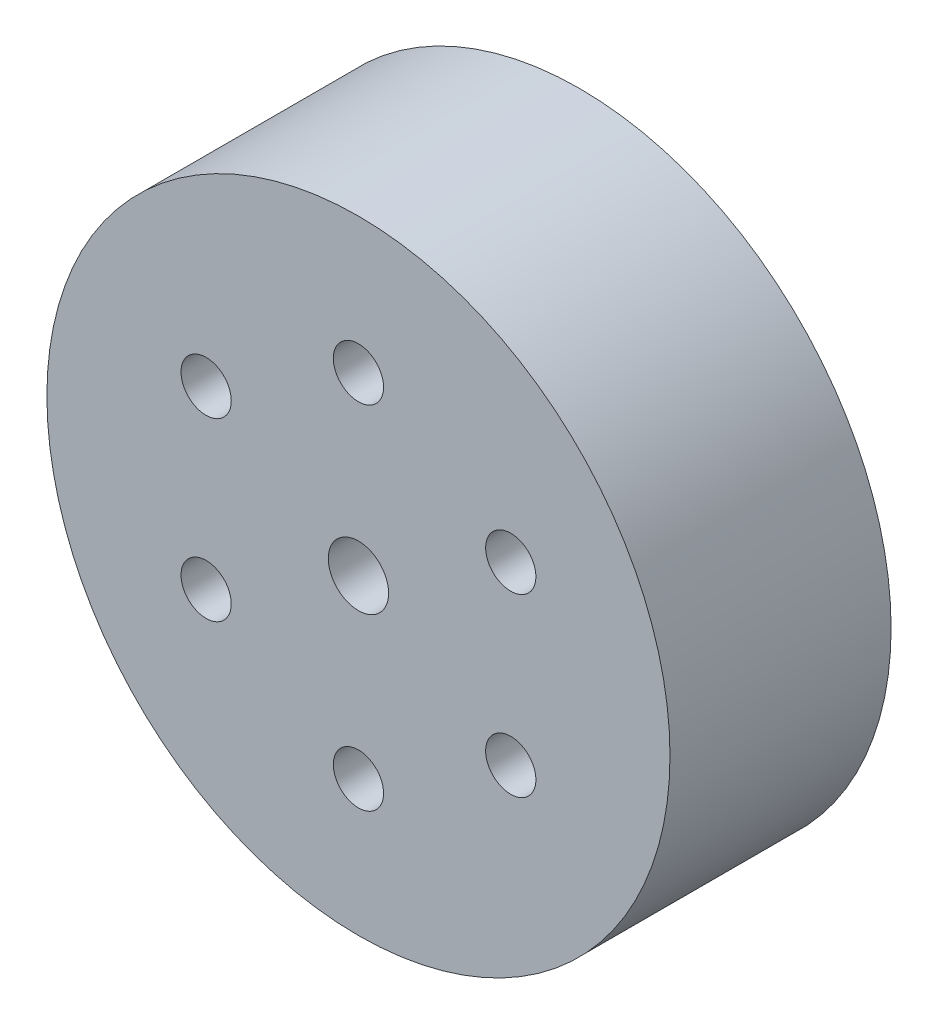
ISO-10303-21;
HEADER;
FILE_DESCRIPTION(('STEP AP214'),'2;1');
FILE_NAME('part.step','',(''),(''),'','','');
FILE_SCHEMA(('AUTOMOTIVE_DESIGN { 1 0 10303 214 1 1 1 1 }'));
ENDSEC;
DATA;
#1=APPLICATION_CONTEXT('core data for automotive mechanical design processes');
#2=APPLICATION_PROTOCOL_DEFINITION('international standard','automotive_design',2000,#1);
#3=PRODUCT_CONTEXT('',#1,'mechanical');
#4=PRODUCT('Part','Part','',(#3));
#5=PRODUCT_RELATED_PRODUCT_CATEGORY('part','',(#4));
#6=PRODUCT_DEFINITION_FORMATION('','',#4);
#7=PRODUCT_DEFINITION_CONTEXT('part definition',#1,'design');
#8=PRODUCT_DEFINITION('design','',#6,#7);
#9=PRODUCT_DEFINITION_SHAPE('','',#8);
#10=(LENGTH_UNIT() NAMED_UNIT(*) SI_UNIT(.MILLI.,.METRE.));
#11=(NAMED_UNIT(*) PLANE_ANGLE_UNIT() SI_UNIT($,.RADIAN.));
#12=(NAMED_UNIT(*) SI_UNIT($,.STERADIAN.) SOLID_ANGLE_UNIT());
#13=UNCERTAINTY_MEASURE_WITH_UNIT(LENGTH_MEASURE(1.E-05),#10,'distance_accuracy_value','');
#14=(GEOMETRIC_REPRESENTATION_CONTEXT(3) GLOBAL_UNCERTAINTY_ASSIGNED_CONTEXT((#13)) GLOBAL_UNIT_ASSIGNED_CONTEXT((#10,
#11,#12)) REPRESENTATION_CONTEXT('',''));
#15=CARTESIAN_POINT('',(0.,0.,0.));
#16=DIRECTION('',(0.,0.,1.));
#17=DIRECTION('',(1.,0.,0.));
#18=AXIS2_PLACEMENT_3D('',#15,#16,#17);
#19=CARTESIAN_POINT('',(0.,0.,11.));
#20=DIRECTION('',(0.,0.,1.));
#21=DIRECTION('',(1.,0.,0.));
#22=AXIS2_PLACEMENT_3D('',#19,#20,#21);
#23=PLANE('',#22);
#24=CARTESIAN_POINT('',(-7.57772228311384,-4.375,11.));
#25=DIRECTION('',(0.,0.,1.));
#26=DIRECTION('',(1.,0.,0.));
#27=AXIS2_PLACEMENT_3D('',#24,#25,#26);
#28=CIRCLE('',#27,1.25);
#29=CARTESIAN_POINT('',(-6.32772228311384,-4.375,11.));
#30=VERTEX_POINT('',#29);
#31=EDGE_CURVE('E71',#30,#30,#28,.T.);
#32=ORIENTED_EDGE('',*,*,#31,.F.);
#33=EDGE_LOOP('',(#32));
#34=FACE_BOUND('',#33,.T.);
#35=CARTESIAN_POINT('',(7.57772228311384,-4.375,11.));
#36=DIRECTION('',(0.,0.,1.));
#37=DIRECTION('',(1.,0.,0.));
#38=AXIS2_PLACEMENT_3D('',#35,#36,#37);
#39=CIRCLE('',#38,1.25);
#40=CARTESIAN_POINT('',(8.82772228311384,-4.375,11.));
#41=VERTEX_POINT('',#40);
#42=EDGE_CURVE('E59',#41,#41,#39,.T.);
#43=ORIENTED_EDGE('',*,*,#42,.F.);
#44=EDGE_LOOP('',(#43));
#45=FACE_BOUND('',#44,.T.);
#46=CARTESIAN_POINT('',(0.,8.75,11.));
#47=DIRECTION('',(0.,0.,1.));
#48=DIRECTION('',(1.,0.,0.));
#49=AXIS2_PLACEMENT_3D('',#46,#47,#48);
#50=CIRCLE('',#49,1.25);
#51=CARTESIAN_POINT('',(1.25,8.75,11.));
#52=VERTEX_POINT('',#51);
#53=EDGE_CURVE('E47',#52,#52,#50,.T.);
#54=ORIENTED_EDGE('',*,*,#53,.F.);
#55=EDGE_LOOP('',(#54));
#56=FACE_BOUND('',#55,.T.);
#57=CARTESIAN_POINT('',(0.,0.,11.));
#58=DIRECTION('',(0.,0.,1.));
#59=DIRECTION('',(1.,0.,0.));
#60=AXIS2_PLACEMENT_3D('',#57,#58,#59);
#61=CIRCLE('',#60,15.5);
#62=CARTESIAN_POINT('',(15.5,0.,11.));
#63=VERTEX_POINT('',#62);
#64=EDGE_CURVE('E10',#63,#63,#61,.T.);
#65=ORIENTED_EDGE('',*,*,#64,.T.);
#66=EDGE_LOOP('',(#65));
#67=FACE_BOUND('',#66,.T.);
#68=CARTESIAN_POINT('',(0.,0.,11.));
#69=DIRECTION('',(0.,0.,1.));
#70=DIRECTION('',(1.,0.,0.));
#71=AXIS2_PLACEMENT_3D('',#68,#69,#70);
#72=CIRCLE('',#71,1.5);
#73=CARTESIAN_POINT('',(1.5,0.,11.));
#74=VERTEX_POINT('',#73);
#75=EDGE_CURVE('E42',#74,#74,#72,.T.);
#76=ORIENTED_EDGE('',*,*,#75,.F.);
#77=EDGE_LOOP('',(#76));
#78=FACE_BOUND('',#77,.T.);
#79=CARTESIAN_POINT('',(7.57772228311384,4.375,11.));
#80=DIRECTION('',(0.,0.,1.));
#81=DIRECTION('',(1.,0.,0.));
#82=AXIS2_PLACEMENT_3D('',#79,#80,#81);
#83=CIRCLE('',#82,1.25);
#84=CARTESIAN_POINT('',(8.82772228311384,4.375,11.));
#85=VERTEX_POINT('',#84);
#86=EDGE_CURVE('E53',#85,#85,#83,.T.);
#87=ORIENTED_EDGE('',*,*,#86,.F.);
#88=EDGE_LOOP('',(#87));
#89=FACE_BOUND('',#88,.T.);
#90=CARTESIAN_POINT('',(0.,-8.75,11.));
#91=DIRECTION('',(0.,0.,1.));
#92=DIRECTION('',(1.,0.,0.));
#93=AXIS2_PLACEMENT_3D('',#90,#91,#92);
#94=CIRCLE('',#93,1.25);
#95=CARTESIAN_POINT('',(1.25,-8.75,11.));
#96=VERTEX_POINT('',#95);
#97=EDGE_CURVE('E65',#96,#96,#94,.T.);
#98=ORIENTED_EDGE('',*,*,#97,.F.);
#99=EDGE_LOOP('',(#98));
#100=FACE_BOUND('',#99,.T.);
#101=CARTESIAN_POINT('',(-7.57772228311384,4.37499999999999,11.));
#102=DIRECTION('',(0.,0.,1.));
#103=DIRECTION('',(1.,0.,0.));
#104=AXIS2_PLACEMENT_3D('',#101,#102,#103);
#105=CIRCLE('',#104,1.25);
#106=CARTESIAN_POINT('',(-6.32772228311384,4.37499999999999,11.));
#107=VERTEX_POINT('',#106);
#108=EDGE_CURVE('E77',#107,#107,#105,.T.);
#109=ORIENTED_EDGE('',*,*,#108,.F.);
#110=EDGE_LOOP('',(#109));
#111=FACE_BOUND('',#110,.T.);
#112=ADVANCED_FACE('F31',(#34,#45,#56,#67,#78,#89,#100,#111),#23,.T.);
#113=CARTESIAN_POINT('',(0.,0.,0.));
#114=DIRECTION('',(0.,0.,1.));
#115=DIRECTION('',(1.,0.,0.));
#116=AXIS2_PLACEMENT_3D('',#113,#114,#115);
#117=PLANE('',#116);
#118=CARTESIAN_POINT('',(0.,0.,0.));
#119=DIRECTION('',(0.,0.,1.));
#120=DIRECTION('',(1.,0.,0.));
#121=AXIS2_PLACEMENT_3D('',#118,#119,#120);
#122=CIRCLE('',#121,15.5);
#123=CARTESIAN_POINT('',(15.5,0.,0.));
#124=VERTEX_POINT('',#123);
#125=EDGE_CURVE('E35',#124,#124,#122,.T.);
#126=ORIENTED_EDGE('',*,*,#125,.F.);
#127=EDGE_LOOP('',(#126));
#128=FACE_BOUND('',#127,.T.);
#129=CARTESIAN_POINT('',(0.,0.,0.));
#130=DIRECTION('',(0.,0.,1.));
#131=DIRECTION('',(1.,0.,0.));
#132=AXIS2_PLACEMENT_3D('',#129,#130,#131);
#133=CIRCLE('',#132,1.5);
#134=CARTESIAN_POINT('',(1.5,0.,0.));
#135=VERTEX_POINT('',#134);
#136=EDGE_CURVE('E44',#135,#135,#133,.T.);
#137=ORIENTED_EDGE('',*,*,#136,.T.);
#138=EDGE_LOOP('',(#137));
#139=FACE_BOUND('',#138,.T.);
#140=CARTESIAN_POINT('',(0.,8.75,0.));
#141=DIRECTION('',(0.,0.,1.));
#142=DIRECTION('',(1.,0.,0.));
#143=AXIS2_PLACEMENT_3D('',#140,#141,#142);
#144=CIRCLE('',#143,1.25);
#145=CARTESIAN_POINT('',(1.25,8.75,0.));
#146=VERTEX_POINT('',#145);
#147=EDGE_CURVE('E50',#146,#146,#144,.T.);
#148=ORIENTED_EDGE('',*,*,#147,.T.);
#149=EDGE_LOOP('',(#148));
#150=FACE_BOUND('',#149,.T.);
#151=CARTESIAN_POINT('',(7.57772228311384,4.375,0.));
#152=DIRECTION('',(0.,0.,1.));
#153=DIRECTION('',(1.,0.,0.));
#154=AXIS2_PLACEMENT_3D('',#151,#152,#153);
#155=CIRCLE('',#154,1.25);
#156=CARTESIAN_POINT('',(8.82772228311384,4.375,0.));
#157=VERTEX_POINT('',#156);
#158=EDGE_CURVE('E56',#157,#157,#155,.T.);
#159=ORIENTED_EDGE('',*,*,#158,.T.);
#160=EDGE_LOOP('',(#159));
#161=FACE_BOUND('',#160,.T.);
#162=CARTESIAN_POINT('',(7.57772228311384,-4.375,0.));
#163=DIRECTION('',(0.,0.,1.));
#164=DIRECTION('',(1.,0.,0.));
#165=AXIS2_PLACEMENT_3D('',#162,#163,#164);
#166=CIRCLE('',#165,1.25);
#167=CARTESIAN_POINT('',(8.82772228311384,-4.375,0.));
#168=VERTEX_POINT('',#167);
#169=EDGE_CURVE('E62',#168,#168,#166,.T.);
#170=ORIENTED_EDGE('',*,*,#169,.T.);
#171=EDGE_LOOP('',(#170));
#172=FACE_BOUND('',#171,.T.);
#173=CARTESIAN_POINT('',(0.,-8.75,0.));
#174=DIRECTION('',(0.,0.,1.));
#175=DIRECTION('',(1.,0.,0.));
#176=AXIS2_PLACEMENT_3D('',#173,#174,#175);
#177=CIRCLE('',#176,1.25);
#178=CARTESIAN_POINT('',(1.25,-8.75,0.));
#179=VERTEX_POINT('',#178);
#180=EDGE_CURVE('E68',#179,#179,#177,.T.);
#181=ORIENTED_EDGE('',*,*,#180,.T.);
#182=EDGE_LOOP('',(#181));
#183=FACE_BOUND('',#182,.T.);
#184=CARTESIAN_POINT('',(-7.57772228311384,-4.375,0.));
#185=DIRECTION('',(0.,0.,1.));
#186=DIRECTION('',(1.,0.,0.));
#187=AXIS2_PLACEMENT_3D('',#184,#185,#186);
#188=CIRCLE('',#187,1.25);
#189=CARTESIAN_POINT('',(-6.32772228311384,-4.375,0.));
#190=VERTEX_POINT('',#189);
#191=EDGE_CURVE('E74',#190,#190,#188,.T.);
#192=ORIENTED_EDGE('',*,*,#191,.T.);
#193=EDGE_LOOP('',(#192));
#194=FACE_BOUND('',#193,.T.);
#195=CARTESIAN_POINT('',(-7.57772228311384,4.37499999999999,0.));
#196=DIRECTION('',(0.,0.,1.));
#197=DIRECTION('',(1.,0.,0.));
#198=AXIS2_PLACEMENT_3D('',#195,#196,#197);
#199=CIRCLE('',#198,1.25);
#200=CARTESIAN_POINT('',(-6.32772228311384,4.37499999999999,0.));
#201=VERTEX_POINT('',#200);
#202=EDGE_CURVE('E80',#201,#201,#199,.T.);
#203=ORIENTED_EDGE('',*,*,#202,.T.);
#204=EDGE_LOOP('',(#203));
#205=FACE_BOUND('',#204,.T.);
#206=ADVANCED_FACE('F90',(#128,#139,#150,#161,#172,#183,#194,#205),#117,.F.);
#207=CARTESIAN_POINT('',(0.,0.,11.));
#208=DIRECTION('',(0.,0.,-1.));
#209=DIRECTION('',(-1.,0.,0.));
#210=AXIS2_PLACEMENT_3D('',#207,#208,#209);
#211=CYLINDRICAL_SURFACE('',#210,15.5);
#212=ORIENTED_EDGE('',*,*,#64,.F.);
#213=EDGE_LOOP('',(#212));
#214=FACE_BOUND('',#213,.T.);
#215=ORIENTED_EDGE('',*,*,#125,.T.);
#216=EDGE_LOOP('',(#215));
#217=FACE_BOUND('',#216,.T.);
#218=ADVANCED_FACE('F33',(#214,#217),#211,.T.);
#219=CARTESIAN_POINT('',(0.,0.,11.));
#220=DIRECTION('',(0.,0.,-1.));
#221=DIRECTION('',(-1.,0.,0.));
#222=AXIS2_PLACEMENT_3D('',#219,#220,#221);
#223=CYLINDRICAL_SURFACE('',#222,1.5);
#224=ORIENTED_EDGE('',*,*,#75,.T.);
#225=EDGE_LOOP('',(#224));
#226=FACE_BOUND('',#225,.T.);
#227=ORIENTED_EDGE('',*,*,#136,.F.);
#228=EDGE_LOOP('',(#227));
#229=FACE_BOUND('',#228,.T.);
#230=ADVANCED_FACE('F100',(#226,#229),#223,.F.);
#231=CARTESIAN_POINT('',(0.,8.75,11.));
#232=DIRECTION('',(0.,0.,-1.));
#233=DIRECTION('',(-1.,0.,0.));
#234=AXIS2_PLACEMENT_3D('',#231,#232,#233);
#235=CYLINDRICAL_SURFACE('',#234,1.25);
#236=ORIENTED_EDGE('',*,*,#53,.T.);
#237=EDGE_LOOP('',(#236));
#238=FACE_BOUND('',#237,.T.);
#239=ORIENTED_EDGE('',*,*,#147,.F.);
#240=EDGE_LOOP('',(#239));
#241=FACE_BOUND('',#240,.T.);
#242=ADVANCED_FACE('F103',(#238,#241),#235,.F.);
#243=CARTESIAN_POINT('',(7.57772228311384,4.375,11.));
#244=DIRECTION('',(0.,0.,-1.));
#245=DIRECTION('',(-1.,0.,0.));
#246=AXIS2_PLACEMENT_3D('',#243,#244,#245);
#247=CYLINDRICAL_SURFACE('',#246,1.25);
#248=ORIENTED_EDGE('',*,*,#86,.T.);
#249=EDGE_LOOP('',(#248));
#250=FACE_BOUND('',#249,.T.);
#251=ORIENTED_EDGE('',*,*,#158,.F.);
#252=EDGE_LOOP('',(#251));
#253=FACE_BOUND('',#252,.T.);
#254=ADVANCED_FACE('F107',(#250,#253),#247,.F.);
#255=CARTESIAN_POINT('',(7.57772228311384,-4.375,11.));
#256=DIRECTION('',(0.,0.,-1.));
#257=DIRECTION('',(-1.,0.,0.));
#258=AXIS2_PLACEMENT_3D('',#255,#256,#257);
#259=CYLINDRICAL_SURFACE('',#258,1.25);
#260=ORIENTED_EDGE('',*,*,#42,.T.);
#261=EDGE_LOOP('',(#260));
#262=FACE_BOUND('',#261,.T.);
#263=ORIENTED_EDGE('',*,*,#169,.F.);
#264=EDGE_LOOP('',(#263));
#265=FACE_BOUND('',#264,.T.);
#266=ADVANCED_FACE('F111',(#262,#265),#259,.F.);
#267=CARTESIAN_POINT('',(0.,-8.75,11.));
#268=DIRECTION('',(0.,0.,-1.));
#269=DIRECTION('',(-1.,0.,0.));
#270=AXIS2_PLACEMENT_3D('',#267,#268,#269);
#271=CYLINDRICAL_SURFACE('',#270,1.25);
#272=ORIENTED_EDGE('',*,*,#97,.T.);
#273=EDGE_LOOP('',(#272));
#274=FACE_BOUND('',#273,.T.);
#275=ORIENTED_EDGE('',*,*,#180,.F.);
#276=EDGE_LOOP('',(#275));
#277=FACE_BOUND('',#276,.T.);
#278=ADVANCED_FACE('F115',(#274,#277),#271,.F.);
#279=CARTESIAN_POINT('',(-7.57772228311384,-4.375,11.));
#280=DIRECTION('',(0.,0.,-1.));
#281=DIRECTION('',(-1.,0.,0.));
#282=AXIS2_PLACEMENT_3D('',#279,#280,#281);
#283=CYLINDRICAL_SURFACE('',#282,1.25);
#284=ORIENTED_EDGE('',*,*,#31,.T.);
#285=EDGE_LOOP('',(#284));
#286=FACE_BOUND('',#285,.T.);
#287=ORIENTED_EDGE('',*,*,#191,.F.);
#288=EDGE_LOOP('',(#287));
#289=FACE_BOUND('',#288,.T.);
#290=ADVANCED_FACE('F119',(#286,#289),#283,.F.);
#291=CARTESIAN_POINT('',(-7.57772228311384,4.37499999999999,11.));
#292=DIRECTION('',(0.,0.,-1.));
#293=DIRECTION('',(-1.,0.,0.));
#294=AXIS2_PLACEMENT_3D('',#291,#292,#293);
#295=CYLINDRICAL_SURFACE('',#294,1.25);
#296=ORIENTED_EDGE('',*,*,#108,.T.);
#297=EDGE_LOOP('',(#296));
#298=FACE_BOUND('',#297,.T.);
#299=ORIENTED_EDGE('',*,*,#202,.F.);
#300=EDGE_LOOP('',(#299));
#301=FACE_BOUND('',#300,.T.);
#302=ADVANCED_FACE('F86',(#298,#301),#295,.F.);
#303=CLOSED_SHELL('',(#112,#206,#218,#230,#242,#254,#266,#278,#290,#302));
#304=MANIFOLD_SOLID_BREP('B2',#303);
#305=ADVANCED_BREP_SHAPE_REPRESENTATION('',(#18,#304),#14);
#306=SHAPE_DEFINITION_REPRESENTATION(#9,#305);
ENDSEC;
END-ISO-10303-21;
